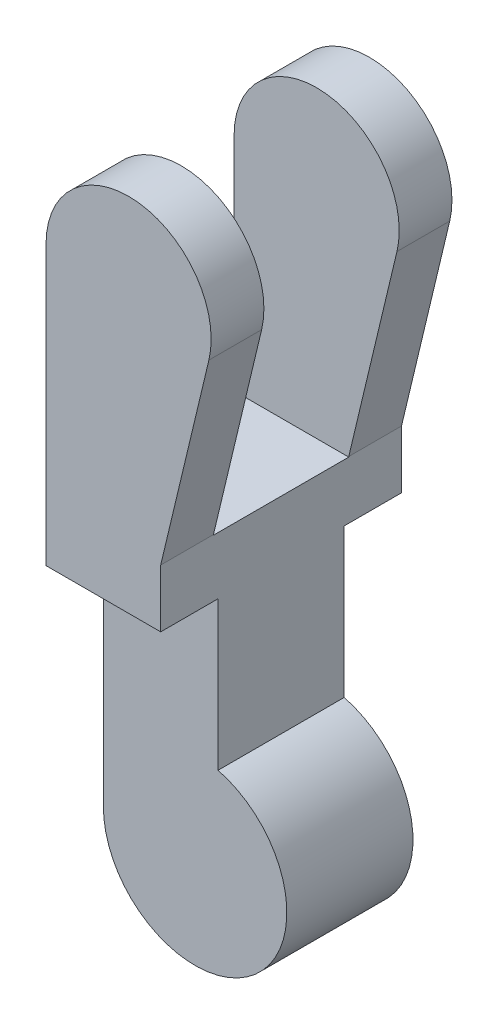
ISO-10303-21;
HEADER;
FILE_DESCRIPTION(('STEP AP214'),'2;1');
FILE_NAME('part.step','',(''),(''),'','','');
FILE_SCHEMA(('AUTOMOTIVE_DESIGN { 1 0 10303 214 1 1 1 1 }'));
ENDSEC;
DATA;
#1=APPLICATION_CONTEXT('core data for automotive mechanical design processes');
#2=APPLICATION_PROTOCOL_DEFINITION('international standard','automotive_design',2000,#1);
#3=PRODUCT_CONTEXT('',#1,'mechanical');
#4=PRODUCT('Part','Part','',(#3));
#5=PRODUCT_RELATED_PRODUCT_CATEGORY('part','',(#4));
#6=PRODUCT_DEFINITION_FORMATION('','',#4);
#7=PRODUCT_DEFINITION_CONTEXT('part definition',#1,'design');
#8=PRODUCT_DEFINITION('design','',#6,#7);
#9=PRODUCT_DEFINITION_SHAPE('','',#8);
#10=(LENGTH_UNIT() NAMED_UNIT(*) SI_UNIT(.MILLI.,.METRE.));
#11=(NAMED_UNIT(*) PLANE_ANGLE_UNIT() SI_UNIT($,.RADIAN.));
#12=(NAMED_UNIT(*) SI_UNIT($,.STERADIAN.) SOLID_ANGLE_UNIT());
#13=UNCERTAINTY_MEASURE_WITH_UNIT(LENGTH_MEASURE(1.E-05),#10,'distance_accuracy_value','');
#14=(GEOMETRIC_REPRESENTATION_CONTEXT(3) GLOBAL_UNCERTAINTY_ASSIGNED_CONTEXT((#13)) GLOBAL_UNIT_ASSIGNED_CONTEXT((#10,
#11,#12)) REPRESENTATION_CONTEXT('',''));
#15=CARTESIAN_POINT('',(0.,0.,0.));
#16=DIRECTION('',(0.,0.,1.));
#17=DIRECTION('',(1.,0.,0.));
#18=AXIS2_PLACEMENT_3D('',#15,#16,#17);
#19=CARTESIAN_POINT('',(20.,257.459666924148,105.));
#20=DIRECTION('',(-0.972594243663535,0.232509004540803,0.));
#21=DIRECTION('',(-0.232509004540804,-0.972594243663536,0.));
#22=AXIS2_PLACEMENT_3D('',#19,#20,#21);
#23=PLANE('',#22);
#24=DIRECTION('',(0.,0.,-1.));
#25=VECTOR('',#24,1.);
#26=CARTESIAN_POINT('',(20.,257.459666924148,105.));
#27=LINE('',#26,#25);
#28=CARTESIAN_POINT('',(20.,257.459666924148,105.));
#29=VERTEX_POINT('',#28);
#30=CARTESIAN_POINT('',(20.,257.459666924148,59.));
#31=VERTEX_POINT('',#30);
#32=EDGE_CURVE('E173',#29,#31,#27,.T.);
#33=ORIENTED_EDGE('',*,*,#32,.T.);
#34=DIRECTION('',(0.232509004540804,0.972594243663536,0.));
#35=VECTOR('',#34,1.);
#36=CARTESIAN_POINT('',(20.,257.459666924148,59.));
#37=LINE('',#36,#35);
#38=CARTESIAN_POINT('',(62.0267855437746,433.259351673062,59.));
#39=VERTEX_POINT('',#38);
#40=EDGE_CURVE('E217',#31,#39,#37,.T.);
#41=ORIENTED_EDGE('',*,*,#40,.T.);
#42=DIRECTION('',(0.,0.,-1.));
#43=VECTOR('',#42,1.);
#44=CARTESIAN_POINT('',(62.0267855437746,433.259351673062,105.));
#45=LINE('',#44,#43);
#46=CARTESIAN_POINT('',(62.0267855437746,433.259351673062,105.));
#47=VERTEX_POINT('',#46);
#48=EDGE_CURVE('E165',#47,#39,#45,.T.);
#49=ORIENTED_EDGE('',*,*,#48,.F.);
#50=DIRECTION('',(0.232509004540803,0.972594243663535,0.));
#51=VECTOR('',#50,1.);
#52=CARTESIAN_POINT('',(20.,257.459666924148,105.));
#53=LINE('',#52,#51);
#54=EDGE_CURVE('E224',#29,#47,#53,.T.);
#55=ORIENTED_EDGE('',*,*,#54,.F.);
#56=EDGE_LOOP('',(#33,#41,#49,#55));
#57=FACE_BOUND('',#56,.T.);
#58=ADVANCED_FACE('F34',(#57),#23,.F.);
#59=CARTESIAN_POINT('',(-8.00000000000001,450.,105.));
#60=DIRECTION('',(0.,0.,-1.));
#61=DIRECTION('',(-1.,0.,0.));
#62=AXIS2_PLACEMENT_3D('',#59,#60,#61);
#63=CYLINDRICAL_SURFACE('',#62,72.);
#64=CARTESIAN_POINT('',(-8.00000000000001,450.,59.));
#65=DIRECTION('',(0.,0.,1.));
#66=DIRECTION('',(0.,-1.,0.));
#67=AXIS2_PLACEMENT_3D('',#64,#65,#66);
#68=CIRCLE('',#67,72.);
#69=CARTESIAN_POINT('',(-80.,450.,59.));
#70=VERTEX_POINT('',#69);
#71=EDGE_CURVE('E215',#39,#70,#68,.T.);
#72=ORIENTED_EDGE('',*,*,#71,.T.);
#73=DIRECTION('',(0.,0.,-1.));
#74=VECTOR('',#73,1.);
#75=CARTESIAN_POINT('',(-80.,450.,105.));
#76=LINE('',#75,#74);
#77=CARTESIAN_POINT('',(-80.,450.,105.));
#78=VERTEX_POINT('',#77);
#79=EDGE_CURVE('E156',#78,#70,#76,.T.);
#80=ORIENTED_EDGE('',*,*,#79,.F.);
#81=CARTESIAN_POINT('',(-8.00000000000001,450.,105.));
#82=DIRECTION('',(0.,0.,1.));
#83=DIRECTION('',(1.,0.,0.));
#84=AXIS2_PLACEMENT_3D('',#81,#82,#83);
#85=CIRCLE('',#84,72.);
#86=EDGE_CURVE('E227',#47,#78,#85,.T.);
#87=ORIENTED_EDGE('',*,*,#86,.F.);
#88=ORIENTED_EDGE('',*,*,#48,.T.);
#89=EDGE_LOOP('',(#72,#80,#87,#88));
#90=FACE_BOUND('',#89,.T.);
#91=ADVANCED_FACE('F286',(#90),#63,.T.);
#92=CARTESIAN_POINT('',(0.,0.,105.));
#93=DIRECTION('',(0.,0.,-1.));
#94=DIRECTION('',(-1.,0.,0.));
#95=AXIS2_PLACEMENT_3D('',#92,#93,#94);
#96=CYLINDRICAL_SURFACE('',#95,80.);
#97=DIRECTION('',(0.,0.,-1.));
#98=VECTOR('',#97,1.);
#99=CARTESIAN_POINT('',(20.,77.4596669241483,105.));
#100=LINE('',#99,#98);
#101=CARTESIAN_POINT('',(20.,77.4596669241483,55.));
#102=VERTEX_POINT('',#101);
#103=CARTESIAN_POINT('',(20.,77.4596669241483,-55.));
#104=VERTEX_POINT('',#103);
#105=EDGE_CURVE('E42',#102,#104,#100,.T.);
#106=ORIENTED_EDGE('',*,*,#105,.F.);
#107=CARTESIAN_POINT('',(0.,0.,55.));
#108=DIRECTION('',(0.,0.,-1.));
#109=DIRECTION('',(0.,1.,0.));
#110=AXIS2_PLACEMENT_3D('',#107,#108,#109);
#111=CIRCLE('',#110,80.);
#112=CARTESIAN_POINT('',(-80.,0.,55.));
#113=VERTEX_POINT('',#112);
#114=EDGE_CURVE('E187',#102,#113,#111,.T.);
#115=ORIENTED_EDGE('',*,*,#114,.T.);
#116=DIRECTION('',(0.,0.,-1.));
#117=VECTOR('',#116,1.);
#118=CARTESIAN_POINT('',(-80.,0.,105.));
#119=LINE('',#118,#117);
#120=CARTESIAN_POINT('',(-80.,0.,-55.));
#121=VERTEX_POINT('',#120);
#122=EDGE_CURVE('E167',#113,#121,#119,.T.);
#123=ORIENTED_EDGE('',*,*,#122,.T.);
#124=CARTESIAN_POINT('',(0.,0.,-55.));
#125=DIRECTION('',(0.,0.,1.));
#126=DIRECTION('',(0.,-1.,0.));
#127=AXIS2_PLACEMENT_3D('',#124,#125,#126);
#128=CIRCLE('',#127,80.);
#129=EDGE_CURVE('E189',#121,#104,#128,.T.);
#130=ORIENTED_EDGE('',*,*,#129,.T.);
#131=EDGE_LOOP('',(#106,#115,#123,#130));
#132=FACE_BOUND('',#131,.T.);
#133=ADVANCED_FACE('F36',(#132),#96,.T.);
#134=CARTESIAN_POINT('',(20.,77.4596669241483,105.));
#135=DIRECTION('',(-1.,0.,0.));
#136=DIRECTION('',(0.,0.,1.));
#137=AXIS2_PLACEMENT_3D('',#134,#135,#136);
#138=PLANE('',#137);
#139=DIRECTION('',(0.,0.,1.));
#140=VECTOR('',#139,1.);
#141=CARTESIAN_POINT('',(20.,257.,105.));
#142=LINE('',#141,#140);
#143=CARTESIAN_POINT('',(20.,257.,-59.));
#144=VERTEX_POINT('',#143);
#145=CARTESIAN_POINT('',(20.,257.,59.));
#146=VERTEX_POINT('',#145);
#147=EDGE_CURVE('E205',#144,#146,#142,.T.);
#148=ORIENTED_EDGE('',*,*,#147,.T.);
#149=DIRECTION('',(0.,1.,0.));
#150=VECTOR('',#149,1.);
#151=CARTESIAN_POINT('',(20.,77.4596669241483,59.));
#152=LINE('',#151,#150);
#153=EDGE_CURVE('E142',#146,#31,#152,.T.);
#154=ORIENTED_EDGE('',*,*,#153,.T.);
#155=ORIENTED_EDGE('',*,*,#32,.F.);
#156=DIRECTION('',(0.,1.,0.));
#157=VECTOR('',#156,1.);
#158=CARTESIAN_POINT('',(20.,77.4596669241483,105.));
#159=LINE('',#158,#157);
#160=CARTESIAN_POINT('',(20.,207.,105.));
#161=VERTEX_POINT('',#160);
#162=EDGE_CURVE('E222',#161,#29,#159,.T.);
#163=ORIENTED_EDGE('',*,*,#162,.F.);
#164=DIRECTION('',(0.,0.,-1.));
#165=VECTOR('',#164,1.);
#166=CARTESIAN_POINT('',(20.,207.,105.));
#167=LINE('',#166,#165);
#168=CARTESIAN_POINT('',(20.,207.,55.));
#169=VERTEX_POINT('',#168);
#170=EDGE_CURVE('E57',#161,#169,#167,.T.);
#171=ORIENTED_EDGE('',*,*,#170,.T.);
#172=DIRECTION('',(0.,-1.,0.));
#173=VECTOR('',#172,1.);
#174=CARTESIAN_POINT('',(20.,77.4596669241484,55.));
#175=LINE('',#174,#173);
#176=EDGE_CURVE('E184',#169,#102,#175,.T.);
#177=ORIENTED_EDGE('',*,*,#176,.T.);
#178=ORIENTED_EDGE('',*,*,#105,.T.);
#179=DIRECTION('',(0.,1.,0.));
#180=VECTOR('',#179,1.);
#181=CARTESIAN_POINT('',(20.,77.4596669241483,-55.));
#182=LINE('',#181,#180);
#183=CARTESIAN_POINT('',(20.,207.,-55.));
#184=VERTEX_POINT('',#183);
#185=EDGE_CURVE('E183',#104,#184,#182,.T.);
#186=ORIENTED_EDGE('',*,*,#185,.T.);
#187=DIRECTION('',(0.,0.,-1.));
#188=VECTOR('',#187,1.);
#189=CARTESIAN_POINT('',(20.,207.,105.));
#190=LINE('',#189,#188);
#191=CARTESIAN_POINT('',(20.,207.,-105.));
#192=VERTEX_POINT('',#191);
#193=EDGE_CURVE('E199',#184,#192,#190,.T.);
#194=ORIENTED_EDGE('',*,*,#193,.T.);
#195=DIRECTION('',(0.,1.,0.));
#196=VECTOR('',#195,1.);
#197=CARTESIAN_POINT('',(20.,77.4596669241483,-105.));
#198=LINE('',#197,#196);
#199=CARTESIAN_POINT('',(20.,257.459666924148,-105.));
#200=VERTEX_POINT('',#199);
#201=EDGE_CURVE('E221',#192,#200,#198,.T.);
#202=ORIENTED_EDGE('',*,*,#201,.T.);
#203=CARTESIAN_POINT('',(20.,257.459666924148,-59.));
#204=VERTEX_POINT('',#203);
#205=EDGE_CURVE('E172',#204,#200,#27,.T.);
#206=ORIENTED_EDGE('',*,*,#205,.F.);
#207=DIRECTION('',(0.,-1.,0.));
#208=VECTOR('',#207,1.);
#209=CARTESIAN_POINT('',(20.,77.4596669241484,-59.));
#210=LINE('',#209,#208);
#211=EDGE_CURVE('E212',#204,#144,#210,.T.);
#212=ORIENTED_EDGE('',*,*,#211,.T.);
#213=EDGE_LOOP('',(#148,#154,#155,#163,#171,#177,#178,#186,#194,#202,#206,#212));
#214=FACE_BOUND('',#213,.T.);
#215=ADVANCED_FACE('F180',(#214),#138,.F.);
#216=CARTESIAN_POINT('',(62.0267855437746,433.259351673062,-59.));
#217=VERTEX_POINT('',#216);
#218=CARTESIAN_POINT('',(62.0267855437746,433.259351673062,-105.));
#219=VERTEX_POINT('',#218);
#220=EDGE_CURVE('E162',#217,#219,#45,.T.);
#221=ORIENTED_EDGE('',*,*,#220,.F.);
#222=DIRECTION('',(-0.232509004540804,-0.972594243663536,0.));
#223=VECTOR('',#222,1.);
#224=CARTESIAN_POINT('',(20.,257.459666924148,-59.));
#225=LINE('',#224,#223);
#226=EDGE_CURVE('E209',#217,#204,#225,.T.);
#227=ORIENTED_EDGE('',*,*,#226,.T.);
#228=ORIENTED_EDGE('',*,*,#205,.T.);
#229=DIRECTION('',(0.232509004540803,0.972594243663535,0.));
#230=VECTOR('',#229,1.);
#231=CARTESIAN_POINT('',(20.,257.459666924148,-105.));
#232=LINE('',#231,#230);
#233=EDGE_CURVE('E232',#200,#219,#232,.T.);
#234=ORIENTED_EDGE('',*,*,#233,.T.);
#235=EDGE_LOOP('',(#221,#227,#228,#234));
#236=FACE_BOUND('',#235,.T.);
#237=ADVANCED_FACE('F289',(#236),#23,.F.);
#238=CARTESIAN_POINT('',(-8.00000000000001,450.,-59.));
#239=DIRECTION('',(0.,0.,-1.));
#240=DIRECTION('',(0.,1.,0.));
#241=AXIS2_PLACEMENT_3D('',#238,#239,#240);
#242=CIRCLE('',#241,72.);
#243=CARTESIAN_POINT('',(-80.,450.,-59.));
#244=VERTEX_POINT('',#243);
#245=EDGE_CURVE('E207',#244,#217,#242,.T.);
#246=ORIENTED_EDGE('',*,*,#245,.T.);
#247=ORIENTED_EDGE('',*,*,#220,.T.);
#248=CARTESIAN_POINT('',(-8.00000000000001,450.,-105.));
#249=DIRECTION('',(0.,0.,1.));
#250=DIRECTION('',(1.,0.,0.));
#251=AXIS2_PLACEMENT_3D('',#248,#249,#250);
#252=CIRCLE('',#251,72.);
#253=CARTESIAN_POINT('',(-80.,450.,-105.));
#254=VERTEX_POINT('',#253);
#255=EDGE_CURVE('E235',#219,#254,#252,.T.);
#256=ORIENTED_EDGE('',*,*,#255,.T.);
#257=EDGE_CURVE('E163',#244,#254,#76,.T.);
#258=ORIENTED_EDGE('',*,*,#257,.F.);
#259=EDGE_LOOP('',(#246,#247,#256,#258));
#260=FACE_BOUND('',#259,.T.);
#261=ADVANCED_FACE('F294',(#260),#63,.T.);
#262=CARTESIAN_POINT('',(-80.,0.,105.));
#263=DIRECTION('',(1.,0.,0.));
#264=DIRECTION('',(0.,0.,-1.));
#265=AXIS2_PLACEMENT_3D('',#262,#263,#264);
#266=PLANE('',#265);
#267=ORIENTED_EDGE('',*,*,#79,.T.);
#268=DIRECTION('',(0.,-1.,0.));
#269=VECTOR('',#268,1.);
#270=CARTESIAN_POINT('',(-80.,0.,59.));
#271=LINE('',#270,#269);
#272=CARTESIAN_POINT('',(-80.,257.,59.));
#273=VERTEX_POINT('',#272);
#274=EDGE_CURVE('E11',#70,#273,#271,.T.);
#275=ORIENTED_EDGE('',*,*,#274,.T.);
#276=DIRECTION('',(0.,0.,-1.));
#277=VECTOR('',#276,1.);
#278=CARTESIAN_POINT('',(-80.,257.,59.));
#279=LINE('',#278,#277);
#280=CARTESIAN_POINT('',(-80.,257.,-59.));
#281=VERTEX_POINT('',#280);
#282=EDGE_CURVE('E148',#273,#281,#279,.T.);
#283=ORIENTED_EDGE('',*,*,#282,.T.);
#284=DIRECTION('',(0.,1.,0.));
#285=VECTOR('',#284,1.);
#286=CARTESIAN_POINT('',(-80.,522.,-59.));
#287=LINE('',#286,#285);
#288=EDGE_CURVE('E49',#281,#244,#287,.T.);
#289=ORIENTED_EDGE('',*,*,#288,.T.);
#290=ORIENTED_EDGE('',*,*,#257,.T.);
#291=DIRECTION('',(0.,-1.,0.));
#292=VECTOR('',#291,1.);
#293=CARTESIAN_POINT('',(-80.,0.,-105.));
#294=LINE('',#293,#292);
#295=CARTESIAN_POINT('',(-80.,207.,-105.));
#296=VERTEX_POINT('',#295);
#297=EDGE_CURVE('E225',#254,#296,#294,.T.);
#298=ORIENTED_EDGE('',*,*,#297,.T.);
#299=DIRECTION('',(0.,0.,1.));
#300=VECTOR('',#299,1.);
#301=CARTESIAN_POINT('',(-80.,207.,-105.));
#302=LINE('',#301,#300);
#303=CARTESIAN_POINT('',(-80.,207.,-55.));
#304=VERTEX_POINT('',#303);
#305=EDGE_CURVE('E240',#296,#304,#302,.T.);
#306=ORIENTED_EDGE('',*,*,#305,.T.);
#307=DIRECTION('',(0.,-1.,0.));
#308=VECTOR('',#307,1.);
#309=CARTESIAN_POINT('',(-80.,207.,-55.));
#310=LINE('',#309,#308);
#311=EDGE_CURVE('E250',#304,#121,#310,.T.);
#312=ORIENTED_EDGE('',*,*,#311,.T.);
#313=ORIENTED_EDGE('',*,*,#122,.F.);
#314=DIRECTION('',(0.,1.,0.));
#315=VECTOR('',#314,1.);
#316=CARTESIAN_POINT('',(-80.,207.,55.));
#317=LINE('',#316,#315);
#318=CARTESIAN_POINT('',(-80.,207.,55.));
#319=VERTEX_POINT('',#318);
#320=EDGE_CURVE('E252',#113,#319,#317,.T.);
#321=ORIENTED_EDGE('',*,*,#320,.T.);
#322=DIRECTION('',(0.,0.,1.));
#323=VECTOR('',#322,1.);
#324=CARTESIAN_POINT('',(-80.,207.,105.));
#325=LINE('',#324,#323);
#326=CARTESIAN_POINT('',(-80.,207.,105.));
#327=VERTEX_POINT('',#326);
#328=EDGE_CURVE('E260',#319,#327,#325,.T.);
#329=ORIENTED_EDGE('',*,*,#328,.T.);
#330=DIRECTION('',(0.,-1.,0.));
#331=VECTOR('',#330,1.);
#332=CARTESIAN_POINT('',(-80.,0.,105.));
#333=LINE('',#332,#331);
#334=EDGE_CURVE('E159',#78,#327,#333,.T.);
#335=ORIENTED_EDGE('',*,*,#334,.F.);
#336=EDGE_LOOP('',(#267,#275,#283,#289,#290,#298,#306,#312,#313,#321,#329,#335));
#337=FACE_BOUND('',#336,.T.);
#338=ADVANCED_FACE('F153',(#337),#266,.F.);
#339=CARTESIAN_POINT('',(0.,0.,105.));
#340=DIRECTION('',(0.,0.,1.));
#341=DIRECTION('',(1.,0.,0.));
#342=AXIS2_PLACEMENT_3D('',#339,#340,#341);
#343=PLANE('',#342);
#344=DIRECTION('',(1.,0.,0.));
#345=VECTOR('',#344,1.);
#346=CARTESIAN_POINT('',(-80.,207.,105.));
#347=LINE('',#346,#345);
#348=EDGE_CURVE('E151',#327,#161,#347,.T.);
#349=ORIENTED_EDGE('',*,*,#348,.T.);
#350=ORIENTED_EDGE('',*,*,#162,.T.);
#351=ORIENTED_EDGE('',*,*,#54,.T.);
#352=ORIENTED_EDGE('',*,*,#86,.T.);
#353=ORIENTED_EDGE('',*,*,#334,.T.);
#354=EDGE_LOOP('',(#349,#350,#351,#352,#353));
#355=FACE_BOUND('',#354,.T.);
#356=ADVANCED_FACE('F272',(#355),#343,.T.);
#357=CARTESIAN_POINT('',(0.,0.,-105.));
#358=DIRECTION('',(0.,0.,1.));
#359=DIRECTION('',(1.,0.,0.));
#360=AXIS2_PLACEMENT_3D('',#357,#358,#359);
#361=PLANE('',#360);
#362=ORIENTED_EDGE('',*,*,#201,.F.);
#363=DIRECTION('',(1.,0.,0.));
#364=VECTOR('',#363,1.);
#365=CARTESIAN_POINT('',(-80.,207.,-105.));
#366=LINE('',#365,#364);
#367=EDGE_CURVE('E248',#296,#192,#366,.T.);
#368=ORIENTED_EDGE('',*,*,#367,.F.);
#369=ORIENTED_EDGE('',*,*,#297,.F.);
#370=ORIENTED_EDGE('',*,*,#255,.F.);
#371=ORIENTED_EDGE('',*,*,#233,.F.);
#372=EDGE_LOOP('',(#362,#368,#369,#370,#371));
#373=FACE_BOUND('',#372,.T.);
#374=ADVANCED_FACE('F246',(#373),#361,.F.);
#375=CARTESIAN_POINT('',(-80.,207.,-55.));
#376=DIRECTION('',(0.,0.,1.));
#377=DIRECTION('',(0.,-1.,0.));
#378=AXIS2_PLACEMENT_3D('',#375,#376,#377);
#379=PLANE('',#378);
#380=ORIENTED_EDGE('',*,*,#311,.F.);
#381=DIRECTION('',(1.,0.,0.));
#382=VECTOR('',#381,1.);
#383=CARTESIAN_POINT('',(-80.,207.,-55.));
#384=LINE('',#383,#382);
#385=EDGE_CURVE('E197',#304,#184,#384,.T.);
#386=ORIENTED_EDGE('',*,*,#385,.T.);
#387=ORIENTED_EDGE('',*,*,#185,.F.);
#388=ORIENTED_EDGE('',*,*,#129,.F.);
#389=EDGE_LOOP('',(#380,#386,#387,#388));
#390=FACE_BOUND('',#389,.T.);
#391=ADVANCED_FACE('F196',(#390),#379,.F.);
#392=CARTESIAN_POINT('',(-80.,207.,-105.));
#393=DIRECTION('',(0.,1.,0.));
#394=DIRECTION('',(0.,0.,1.));
#395=AXIS2_PLACEMENT_3D('',#392,#393,#394);
#396=PLANE('',#395);
#397=ORIENTED_EDGE('',*,*,#385,.F.);
#398=ORIENTED_EDGE('',*,*,#305,.F.);
#399=ORIENTED_EDGE('',*,*,#367,.T.);
#400=ORIENTED_EDGE('',*,*,#193,.F.);
#401=EDGE_LOOP('',(#397,#398,#399,#400));
#402=FACE_BOUND('',#401,.T.);
#403=ADVANCED_FACE('F276',(#402),#396,.F.);
#404=CARTESIAN_POINT('',(-80.,207.,55.));
#405=DIRECTION('',(0.,0.,-1.));
#406=DIRECTION('',(0.,1.,0.));
#407=AXIS2_PLACEMENT_3D('',#404,#405,#406);
#408=PLANE('',#407);
#409=ORIENTED_EDGE('',*,*,#114,.F.);
#410=ORIENTED_EDGE('',*,*,#176,.F.);
#411=DIRECTION('',(1.,0.,0.));
#412=VECTOR('',#411,1.);
#413=CARTESIAN_POINT('',(-80.,207.,55.));
#414=LINE('',#413,#412);
#415=EDGE_CURVE('E262',#319,#169,#414,.T.);
#416=ORIENTED_EDGE('',*,*,#415,.F.);
#417=ORIENTED_EDGE('',*,*,#320,.F.);
#418=EDGE_LOOP('',(#409,#410,#416,#417));
#419=FACE_BOUND('',#418,.T.);
#420=ADVANCED_FACE('F274',(#419),#408,.F.);
#421=CARTESIAN_POINT('',(-80.,207.,105.));
#422=DIRECTION('',(0.,1.,0.));
#423=DIRECTION('',(0.,0.,1.));
#424=AXIS2_PLACEMENT_3D('',#421,#422,#423);
#425=PLANE('',#424);
#426=ORIENTED_EDGE('',*,*,#348,.F.);
#427=ORIENTED_EDGE('',*,*,#328,.F.);
#428=ORIENTED_EDGE('',*,*,#415,.T.);
#429=ORIENTED_EDGE('',*,*,#170,.F.);
#430=EDGE_LOOP('',(#426,#427,#428,#429));
#431=FACE_BOUND('',#430,.T.);
#432=ADVANCED_FACE('F266',(#431),#425,.F.);
#433=CARTESIAN_POINT('',(-80.,522.,59.));
#434=DIRECTION('',(0.,0.,1.));
#435=DIRECTION('',(0.,-1.,0.));
#436=AXIS2_PLACEMENT_3D('',#433,#434,#435);
#437=PLANE('',#436);
#438=DIRECTION('',(1.,0.,0.));
#439=VECTOR('',#438,1.);
#440=CARTESIAN_POINT('',(-80.,257.,59.));
#441=LINE('',#440,#439);
#442=EDGE_CURVE('E137',#273,#146,#441,.T.);
#443=ORIENTED_EDGE('',*,*,#442,.F.);
#444=ORIENTED_EDGE('',*,*,#274,.F.);
#445=ORIENTED_EDGE('',*,*,#71,.F.);
#446=ORIENTED_EDGE('',*,*,#40,.F.);
#447=ORIENTED_EDGE('',*,*,#153,.F.);
#448=EDGE_LOOP('',(#443,#444,#445,#446,#447));
#449=FACE_BOUND('',#448,.T.);
#450=ADVANCED_FACE('F139',(#449),#437,.F.);
#451=CARTESIAN_POINT('',(-80.,522.,-59.));
#452=DIRECTION('',(0.,0.,-1.));
#453=DIRECTION('',(0.,1.,0.));
#454=AXIS2_PLACEMENT_3D('',#451,#452,#453);
#455=PLANE('',#454);
#456=ORIENTED_EDGE('',*,*,#226,.F.);
#457=ORIENTED_EDGE('',*,*,#245,.F.);
#458=ORIENTED_EDGE('',*,*,#288,.F.);
#459=DIRECTION('',(1.,0.,0.));
#460=VECTOR('',#459,1.);
#461=CARTESIAN_POINT('',(-80.,257.,-59.));
#462=LINE('',#461,#460);
#463=EDGE_CURVE('E145',#281,#144,#462,.T.);
#464=ORIENTED_EDGE('',*,*,#463,.T.);
#465=ORIENTED_EDGE('',*,*,#211,.F.);
#466=EDGE_LOOP('',(#456,#457,#458,#464,#465));
#467=FACE_BOUND('',#466,.T.);
#468=ADVANCED_FACE('F305',(#467),#455,.F.);
#469=CARTESIAN_POINT('',(-80.,257.,59.));
#470=DIRECTION('',(0.,-1.,0.));
#471=DIRECTION('',(0.,0.,-1.));
#472=AXIS2_PLACEMENT_3D('',#469,#470,#471);
#473=PLANE('',#472);
#474=ORIENTED_EDGE('',*,*,#463,.F.);
#475=ORIENTED_EDGE('',*,*,#282,.F.);
#476=ORIENTED_EDGE('',*,*,#442,.T.);
#477=ORIENTED_EDGE('',*,*,#147,.F.);
#478=EDGE_LOOP('',(#474,#475,#476,#477));
#479=FACE_BOUND('',#478,.T.);
#480=ADVANCED_FACE('F149',(#479),#473,.F.);
#481=CLOSED_SHELL('',(#58,#91,#133,#215,#237,#261,#338,#356,#374,#391,#403,#420,#432,#450,#468,#480));
#482=MANIFOLD_SOLID_BREP('B2',#481);
#483=ADVANCED_BREP_SHAPE_REPRESENTATION('',(#18,#482),#14);
#484=SHAPE_DEFINITION_REPRESENTATION(#9,#483);
ENDSEC;
END-ISO-10303-21;
